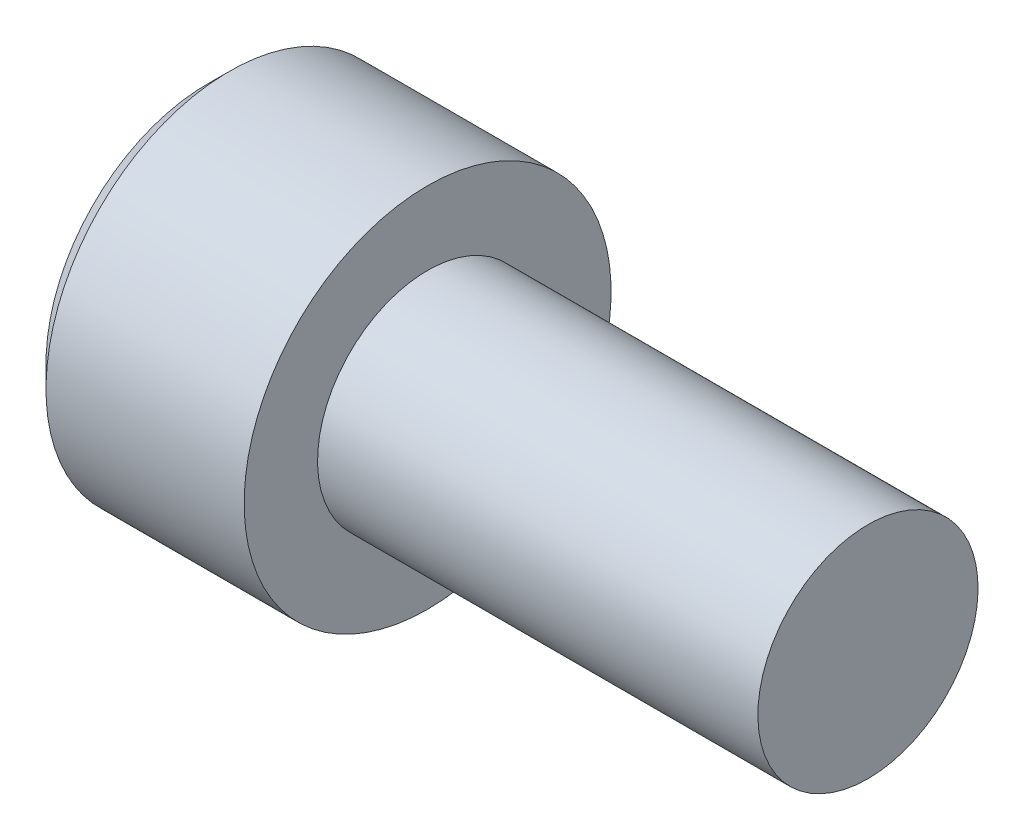
ISO-10303-21;
HEADER;
FILE_DESCRIPTION(('STEP AP214'),'2;1');
FILE_NAME('part.step','',(''),(''),'','','');
FILE_SCHEMA(('AUTOMOTIVE_DESIGN { 1 0 10303 214 1 1 1 1 }'));
ENDSEC;
DATA;
#1=APPLICATION_CONTEXT('core data for automotive mechanical design processes');
#2=APPLICATION_PROTOCOL_DEFINITION('international standard','automotive_design',2000,#1);
#3=PRODUCT_CONTEXT('',#1,'mechanical');
#4=PRODUCT('Part','Part','',(#3));
#5=PRODUCT_RELATED_PRODUCT_CATEGORY('part','',(#4));
#6=PRODUCT_DEFINITION_FORMATION('','',#4);
#7=PRODUCT_DEFINITION_CONTEXT('part definition',#1,'design');
#8=PRODUCT_DEFINITION('design','',#6,#7);
#9=PRODUCT_DEFINITION_SHAPE('','',#8);
#10=(LENGTH_UNIT() NAMED_UNIT(*) SI_UNIT(.MILLI.,.METRE.));
#11=(NAMED_UNIT(*) PLANE_ANGLE_UNIT() SI_UNIT($,.RADIAN.));
#12=(NAMED_UNIT(*) SI_UNIT($,.STERADIAN.) SOLID_ANGLE_UNIT());
#13=UNCERTAINTY_MEASURE_WITH_UNIT(LENGTH_MEASURE(1.E-05),#10,'distance_accuracy_value','');
#14=(GEOMETRIC_REPRESENTATION_CONTEXT(3) GLOBAL_UNCERTAINTY_ASSIGNED_CONTEXT((#13)) GLOBAL_UNIT_ASSIGNED_CONTEXT((#10,
#11,#12)) REPRESENTATION_CONTEXT('',''));
#15=CARTESIAN_POINT('',(0.,0.,0.));
#16=DIRECTION('',(0.,0.,1.));
#17=DIRECTION('',(1.,0.,0.));
#18=AXIS2_PLACEMENT_3D('',#15,#16,#17);
#19=CARTESIAN_POINT('',(-3.,0.,0.));
#20=DIRECTION('',(-1.,0.,0.));
#21=DIRECTION('',(0.,0.,1.));
#22=AXIS2_PLACEMENT_3D('',#19,#20,#21);
#23=PLANE('',#22);
#24=CARTESIAN_POINT('',(-2.9999999999998,0.,0.));
#25=DIRECTION('',(-1.,0.,0.));
#26=DIRECTION('',(0.,0.,1.));
#27=AXIS2_PLACEMENT_3D('',#24,#25,#26);
#28=CIRCLE('',#27,2.49999999999995);
#29=CARTESIAN_POINT('',(-2.9999999999999,2.16506350946107,1.24999999999999));
#30=VERTEX_POINT('',#29);
#31=CARTESIAN_POINT('',(-2.9999999999999,0.,2.49999999999997));
#32=VERTEX_POINT('',#31);
#33=EDGE_CURVE('E20',#30,#32,#28,.F.);
#34=ORIENTED_EDGE('',*,*,#33,.T.);
#35=DIRECTION('',(0.,1.,0.));
#36=VECTOR('',#35,1.);
#37=CARTESIAN_POINT('',(-3.,0.,2.5));
#38=LINE('',#37,#36);
#39=CARTESIAN_POINT('',(-3.,1.44337567297406,2.5));
#40=VERTEX_POINT('',#39);
#41=EDGE_CURVE('E85',#32,#40,#38,.T.);
#42=ORIENTED_EDGE('',*,*,#41,.T.);
#43=DIRECTION('',(0.,0.5,-0.866025403784438));
#44=VECTOR('',#43,1.);
#45=CARTESIAN_POINT('',(-3.,1.44337567297406,2.5));
#46=LINE('',#45,#44);
#47=EDGE_CURVE('E105',#40,#30,#46,.T.);
#48=ORIENTED_EDGE('',*,*,#47,.T.);
#49=EDGE_LOOP('',(#34,#42,#48));
#50=FACE_BOUND('',#49,.T.);
#51=ADVANCED_FACE('F17',(#50),#23,.T.);
#52=CARTESIAN_POINT('',(-3.,0.,0.));
#53=DIRECTION('',(-1.,0.,0.));
#54=DIRECTION('',(0.,0.,1.));
#55=AXIS2_PLACEMENT_3D('',#52,#53,#54);
#56=PLANE('',#55);
#57=CARTESIAN_POINT('',(-2.9999999999998,0.,0.));
#58=DIRECTION('',(-1.,0.,0.));
#59=DIRECTION('',(0.,0.,1.));
#60=AXIS2_PLACEMENT_3D('',#57,#58,#59);
#61=CIRCLE('',#60,2.49999999999995);
#62=CARTESIAN_POINT('',(-2.9999999999999,-2.16506350946107,1.24999999999999));
#63=VERTEX_POINT('',#62);
#64=EDGE_CURVE('E115',#32,#63,#61,.F.);
#65=ORIENTED_EDGE('',*,*,#64,.T.);
#66=DIRECTION('',(0.,0.5,0.866025403784439));
#67=VECTOR('',#66,1.);
#68=CARTESIAN_POINT('',(-3.,-2.1650635094611,1.25));
#69=LINE('',#68,#67);
#70=CARTESIAN_POINT('',(-3.,-1.44337567297406,2.5));
#71=VERTEX_POINT('',#70);
#72=EDGE_CURVE('E123',#63,#71,#69,.T.);
#73=ORIENTED_EDGE('',*,*,#72,.T.);
#74=DIRECTION('',(0.,1.,0.));
#75=VECTOR('',#74,1.);
#76=CARTESIAN_POINT('',(-3.,0.,2.5));
#77=LINE('',#76,#75);
#78=EDGE_CURVE('E131',#71,#32,#77,.T.);
#79=ORIENTED_EDGE('',*,*,#78,.T.);
#80=EDGE_LOOP('',(#65,#73,#79));
#81=FACE_BOUND('',#80,.T.);
#82=ADVANCED_FACE('F367',(#81),#56,.T.);
#83=CARTESIAN_POINT('',(-3.,0.,0.));
#84=DIRECTION('',(-1.,0.,0.));
#85=DIRECTION('',(0.,0.,1.));
#86=AXIS2_PLACEMENT_3D('',#83,#84,#85);
#87=PLANE('',#86);
#88=CARTESIAN_POINT('',(-2.9999999999998,0.,0.));
#89=DIRECTION('',(-1.,0.,0.));
#90=DIRECTION('',(0.,0.,1.));
#91=AXIS2_PLACEMENT_3D('',#88,#89,#90);
#92=CIRCLE('',#91,2.49999999999995);
#93=CARTESIAN_POINT('',(-2.9999999999999,0.,-2.49999999999997));
#94=VERTEX_POINT('',#93);
#95=CARTESIAN_POINT('',(-2.9999999999999,2.16506350946107,-1.24999999999999));
#96=VERTEX_POINT('',#95);
#97=EDGE_CURVE('E101',#94,#96,#92,.F.);
#98=ORIENTED_EDGE('',*,*,#97,.T.);
#99=DIRECTION('',(0.,-0.5,-0.866025403784439));
#100=VECTOR('',#99,1.);
#101=CARTESIAN_POINT('',(-3.,2.1650635094611,-1.25));
#102=LINE('',#101,#100);
#103=CARTESIAN_POINT('',(-3.,1.44337567297406,-2.5));
#104=VERTEX_POINT('',#103);
#105=EDGE_CURVE('E116',#96,#104,#102,.T.);
#106=ORIENTED_EDGE('',*,*,#105,.T.);
#107=DIRECTION('',(0.,1.,0.));
#108=VECTOR('',#107,1.);
#109=CARTESIAN_POINT('',(-3.,0.,-2.5));
#110=LINE('',#109,#108);
#111=EDGE_CURVE('E119',#104,#94,#110,.F.);
#112=ORIENTED_EDGE('',*,*,#111,.T.);
#113=EDGE_LOOP('',(#98,#106,#112));
#114=FACE_BOUND('',#113,.T.);
#115=ADVANCED_FACE('F358',(#114),#87,.T.);
#116=CARTESIAN_POINT('',(-2.99999999999967,0.,0.));
#117=DIRECTION('',(-1.,0.,0.));
#118=DIRECTION('',(0.,0.,1.));
#119=AXIS2_PLACEMENT_3D('',#116,#117,#118);
#120=CONICAL_SURFACE('',#119,2.49999999999972,1.04719755119659);
#121=CARTESIAN_POINT('',(-1.5566243270258,0.,0.));
#122=VERTEX_POINT('',#121);
#123=VERTEX_LOOP('',#122);
#124=FACE_BOUND('',#123,.T.);
#125=ORIENTED_EDGE('',*,*,#33,.F.);
#126=CARTESIAN_POINT('',(-2.9999999999998,0.,0.));
#127=DIRECTION('',(-1.,0.,0.));
#128=DIRECTION('',(0.,0.,1.));
#129=AXIS2_PLACEMENT_3D('',#126,#127,#128);
#130=CIRCLE('',#129,2.49999999999995);
#131=EDGE_CURVE('E91',#96,#30,#130,.F.);
#132=ORIENTED_EDGE('',*,*,#131,.F.);
#133=ORIENTED_EDGE('',*,*,#97,.F.);
#134=CARTESIAN_POINT('',(-2.9999999999998,0.,0.));
#135=DIRECTION('',(-1.,0.,0.));
#136=DIRECTION('',(0.,0.,1.));
#137=AXIS2_PLACEMENT_3D('',#134,#135,#136);
#138=CIRCLE('',#137,2.49999999999995);
#139=CARTESIAN_POINT('',(-2.9999999999999,-2.16506350946107,-1.24999999999999));
#140=VERTEX_POINT('',#139);
#141=EDGE_CURVE('E153',#140,#94,#138,.F.);
#142=ORIENTED_EDGE('',*,*,#141,.F.);
#143=CARTESIAN_POINT('',(-2.9999999999998,0.,0.));
#144=DIRECTION('',(-1.,0.,0.));
#145=DIRECTION('',(0.,0.,1.));
#146=AXIS2_PLACEMENT_3D('',#143,#144,#145);
#147=CIRCLE('',#146,2.49999999999995);
#148=EDGE_CURVE('E117',#63,#140,#147,.F.);
#149=ORIENTED_EDGE('',*,*,#148,.F.);
#150=ORIENTED_EDGE('',*,*,#64,.F.);
#151=EDGE_LOOP('',(#125,#132,#133,#142,#149,#150));
#152=FACE_BOUND('',#151,.T.);
#153=ADVANCED_FACE('F113',(#124,#152),#120,.F.);
#154=CARTESIAN_POINT('',(-3.,0.,0.));
#155=DIRECTION('',(-1.,0.,0.));
#156=DIRECTION('',(0.,0.,1.));
#157=AXIS2_PLACEMENT_3D('',#154,#155,#156);
#158=PLANE('',#157);
#159=ORIENTED_EDGE('',*,*,#141,.T.);
#160=DIRECTION('',(0.,1.,0.));
#161=VECTOR('',#160,1.);
#162=CARTESIAN_POINT('',(-3.,1.44337567297407,-2.5));
#163=LINE('',#162,#161);
#164=CARTESIAN_POINT('',(-3.,-1.44337567297406,-2.5));
#165=VERTEX_POINT('',#164);
#166=EDGE_CURVE('E155',#94,#165,#163,.F.);
#167=ORIENTED_EDGE('',*,*,#166,.T.);
#168=DIRECTION('',(0.,-0.500000000000001,0.866025403784438));
#169=VECTOR('',#168,1.);
#170=CARTESIAN_POINT('',(-3.,-1.44337567297406,-2.5));
#171=LINE('',#170,#169);
#172=EDGE_CURVE('E100',#165,#140,#171,.T.);
#173=ORIENTED_EDGE('',*,*,#172,.T.);
#174=EDGE_LOOP('',(#159,#167,#173));
#175=FACE_BOUND('',#174,.T.);
#176=ADVANCED_FACE('F177',(#175),#158,.T.);
#177=CARTESIAN_POINT('',(-3.,0.,0.));
#178=DIRECTION('',(-1.,0.,0.));
#179=DIRECTION('',(0.,0.,1.));
#180=AXIS2_PLACEMENT_3D('',#177,#178,#179);
#181=PLANE('',#180);
#182=ORIENTED_EDGE('',*,*,#148,.T.);
#183=DIRECTION('',(0.,0.5,-0.866025403784439));
#184=VECTOR('',#183,1.);
#185=CARTESIAN_POINT('',(-3.,-1.44337567297406,-2.5));
#186=LINE('',#185,#184);
#187=CARTESIAN_POINT('',(-3.,-2.88675134594813,0.));
#188=VERTEX_POINT('',#187);
#189=EDGE_CURVE('E162',#140,#188,#186,.F.);
#190=ORIENTED_EDGE('',*,*,#189,.T.);
#191=DIRECTION('',(0.,-0.5,-0.866025403784439));
#192=VECTOR('',#191,1.);
#193=CARTESIAN_POINT('',(-3.,-2.88675134594813,0.));
#194=LINE('',#193,#192);
#195=EDGE_CURVE('E141',#188,#63,#194,.F.);
#196=ORIENTED_EDGE('',*,*,#195,.T.);
#197=EDGE_LOOP('',(#182,#190,#196));
#198=FACE_BOUND('',#197,.T.);
#199=ADVANCED_FACE('F161',(#198),#181,.T.);
#200=CARTESIAN_POINT('',(-3.,0.,0.));
#201=DIRECTION('',(-1.,0.,0.));
#202=DIRECTION('',(0.,0.,1.));
#203=AXIS2_PLACEMENT_3D('',#200,#201,#202);
#204=PLANE('',#203);
#205=ORIENTED_EDGE('',*,*,#131,.T.);
#206=DIRECTION('',(0.,-0.5,0.866025403784439));
#207=VECTOR('',#206,1.);
#208=CARTESIAN_POINT('',(-3.,1.44337567297406,2.5));
#209=LINE('',#208,#207);
#210=CARTESIAN_POINT('',(-3.,2.88675134594813,0.));
#211=VERTEX_POINT('',#210);
#212=EDGE_CURVE('E94',#30,#211,#209,.F.);
#213=ORIENTED_EDGE('',*,*,#212,.T.);
#214=DIRECTION('',(0.,0.5,0.866025403784439));
#215=VECTOR('',#214,1.);
#216=CARTESIAN_POINT('',(-3.,2.88675134594813,0.));
#217=LINE('',#216,#215);
#218=EDGE_CURVE('E96',#211,#96,#217,.F.);
#219=ORIENTED_EDGE('',*,*,#218,.T.);
#220=EDGE_LOOP('',(#205,#213,#219));
#221=FACE_BOUND('',#220,.T.);
#222=ADVANCED_FACE('F93',(#221),#204,.T.);
#223=CARTESIAN_POINT('',(-3.,1.44337567297407,-2.5));
#224=DIRECTION('',(0.,0.,-1.));
#225=DIRECTION('',(-1.,0.,0.));
#226=AXIS2_PLACEMENT_3D('',#223,#224,#225);
#227=PLANE('',#226);
#228=DIRECTION('',(1.,0.,0.));
#229=VECTOR('',#228,1.);
#230=CARTESIAN_POINT('',(-3.,-1.44337567297406,-2.5));
#231=LINE('',#230,#229);
#232=CARTESIAN_POINT('',(-6.,-1.44337567297406,-2.5));
#233=VERTEX_POINT('',#232);
#234=EDGE_CURVE('E126',#233,#165,#231,.T.);
#235=ORIENTED_EDGE('',*,*,#234,.T.);
#236=ORIENTED_EDGE('',*,*,#166,.F.);
#237=ORIENTED_EDGE('',*,*,#111,.F.);
#238=DIRECTION('',(1.,0.,0.));
#239=VECTOR('',#238,1.);
#240=CARTESIAN_POINT('',(-3.,1.44337567297407,-2.5));
#241=LINE('',#240,#239);
#242=CARTESIAN_POINT('',(-6.,1.44337567297407,-2.5));
#243=VERTEX_POINT('',#242);
#244=EDGE_CURVE('E134',#104,#243,#241,.F.);
#245=ORIENTED_EDGE('',*,*,#244,.T.);
#246=DIRECTION('',(0.,1.,0.));
#247=VECTOR('',#246,1.);
#248=CARTESIAN_POINT('',(-6.,0.,-2.5));
#249=LINE('',#248,#247);
#250=EDGE_CURVE('E137',#243,#233,#249,.F.);
#251=ORIENTED_EDGE('',*,*,#250,.T.);
#252=EDGE_LOOP('',(#235,#236,#237,#245,#251));
#253=FACE_BOUND('',#252,.T.);
#254=ADVANCED_FACE('F185',(#253),#227,.F.);
#255=CARTESIAN_POINT('',(-3.,-1.44337567297406,-2.5));
#256=DIRECTION('',(0.,-0.866025403784439,-0.5));
#257=DIRECTION('',(0.,0.5,-0.866025403784439));
#258=AXIS2_PLACEMENT_3D('',#255,#256,#257);
#259=PLANE('',#258);
#260=DIRECTION('',(1.,0.,0.));
#261=VECTOR('',#260,1.);
#262=CARTESIAN_POINT('',(-3.,-2.88675134594813,0.));
#263=LINE('',#262,#261);
#264=CARTESIAN_POINT('',(-6.,-2.88675134594813,0.));
#265=VERTEX_POINT('',#264);
#266=EDGE_CURVE('E173',#265,#188,#263,.T.);
#267=ORIENTED_EDGE('',*,*,#266,.T.);
#268=ORIENTED_EDGE('',*,*,#189,.F.);
#269=ORIENTED_EDGE('',*,*,#172,.F.);
#270=ORIENTED_EDGE('',*,*,#234,.F.);
#271=DIRECTION('',(0.,-0.5,0.866025403784439));
#272=VECTOR('',#271,1.);
#273=CARTESIAN_POINT('',(-6.,-1.44337567297406,-2.5));
#274=LINE('',#273,#272);
#275=EDGE_CURVE('E188',#233,#265,#274,.T.);
#276=ORIENTED_EDGE('',*,*,#275,.T.);
#277=EDGE_LOOP('',(#267,#268,#269,#270,#276));
#278=FACE_BOUND('',#277,.T.);
#279=ADVANCED_FACE('F168',(#278),#259,.F.);
#280=CARTESIAN_POINT('',(-3.,-2.88675134594813,0.));
#281=DIRECTION('',(0.,-0.866025403784439,0.5));
#282=DIRECTION('',(0.,-0.5,-0.866025403784439));
#283=AXIS2_PLACEMENT_3D('',#280,#281,#282);
#284=PLANE('',#283);
#285=DIRECTION('',(1.,0.,0.));
#286=VECTOR('',#285,1.);
#287=CARTESIAN_POINT('',(-3.,-1.44337567297406,2.5));
#288=LINE('',#287,#286);
#289=CARTESIAN_POINT('',(-6.,-1.44337567297406,2.5));
#290=VERTEX_POINT('',#289);
#291=EDGE_CURVE('E138',#290,#71,#288,.T.);
#292=ORIENTED_EDGE('',*,*,#291,.T.);
#293=ORIENTED_EDGE('',*,*,#72,.F.);
#294=ORIENTED_EDGE('',*,*,#195,.F.);
#295=ORIENTED_EDGE('',*,*,#266,.F.);
#296=DIRECTION('',(0.,0.5,0.866025403784439));
#297=VECTOR('',#296,1.);
#298=CARTESIAN_POINT('',(-6.,-2.88675134594813,0.));
#299=LINE('',#298,#297);
#300=EDGE_CURVE('E181',#265,#290,#299,.T.);
#301=ORIENTED_EDGE('',*,*,#300,.T.);
#302=EDGE_LOOP('',(#292,#293,#294,#295,#301));
#303=FACE_BOUND('',#302,.T.);
#304=ADVANCED_FACE('F307',(#303),#284,.F.);
#305=CARTESIAN_POINT('',(-3.,-1.44337567297406,2.5));
#306=DIRECTION('',(0.,0.,1.));
#307=DIRECTION('',(1.,0.,0.));
#308=AXIS2_PLACEMENT_3D('',#305,#306,#307);
#309=PLANE('',#308);
#310=DIRECTION('',(1.,0.,0.));
#311=VECTOR('',#310,1.);
#312=CARTESIAN_POINT('',(-3.,1.44337567297406,2.5));
#313=LINE('',#312,#311);
#314=CARTESIAN_POINT('',(-6.,1.44337567297406,2.5));
#315=VERTEX_POINT('',#314);
#316=EDGE_CURVE('E107',#315,#40,#313,.T.);
#317=ORIENTED_EDGE('',*,*,#316,.T.);
#318=ORIENTED_EDGE('',*,*,#41,.F.);
#319=ORIENTED_EDGE('',*,*,#78,.F.);
#320=ORIENTED_EDGE('',*,*,#291,.F.);
#321=DIRECTION('',(0.,1.,0.));
#322=VECTOR('',#321,1.);
#323=CARTESIAN_POINT('',(-6.,0.,2.5));
#324=LINE('',#323,#322);
#325=EDGE_CURVE('E196',#290,#315,#324,.T.);
#326=ORIENTED_EDGE('',*,*,#325,.T.);
#327=EDGE_LOOP('',(#317,#318,#319,#320,#326));
#328=FACE_BOUND('',#327,.T.);
#329=ADVANCED_FACE('F299',(#328),#309,.F.);
#330=CARTESIAN_POINT('',(-3.,1.44337567297406,2.5));
#331=DIRECTION('',(0.,0.866025403784439,0.5));
#332=DIRECTION('',(0.,-0.5,0.866025403784439));
#333=AXIS2_PLACEMENT_3D('',#330,#331,#332);
#334=PLANE('',#333);
#335=DIRECTION('',(1.,0.,0.));
#336=VECTOR('',#335,1.);
#337=CARTESIAN_POINT('',(-3.,2.88675134594813,0.));
#338=LINE('',#337,#336);
#339=CARTESIAN_POINT('',(-6.,2.88675134594813,0.));
#340=VERTEX_POINT('',#339);
#341=EDGE_CURVE('E106',#340,#211,#338,.T.);
#342=ORIENTED_EDGE('',*,*,#341,.T.);
#343=ORIENTED_EDGE('',*,*,#212,.F.);
#344=ORIENTED_EDGE('',*,*,#47,.F.);
#345=ORIENTED_EDGE('',*,*,#316,.F.);
#346=DIRECTION('',(0.,0.5,-0.866025403784439));
#347=VECTOR('',#346,1.);
#348=CARTESIAN_POINT('',(-6.,1.44337567297406,2.5));
#349=LINE('',#348,#347);
#350=EDGE_CURVE('E35',#315,#340,#349,.T.);
#351=ORIENTED_EDGE('',*,*,#350,.T.);
#352=EDGE_LOOP('',(#342,#343,#344,#345,#351));
#353=FACE_BOUND('',#352,.T.);
#354=ADVANCED_FACE('F104',(#353),#334,.F.);
#355=CARTESIAN_POINT('',(-3.,2.88675134594813,0.));
#356=DIRECTION('',(0.,0.866025403784439,-0.5));
#357=DIRECTION('',(0.,0.5,0.866025403784439));
#358=AXIS2_PLACEMENT_3D('',#355,#356,#357);
#359=PLANE('',#358);
#360=ORIENTED_EDGE('',*,*,#244,.F.);
#361=ORIENTED_EDGE('',*,*,#105,.F.);
#362=ORIENTED_EDGE('',*,*,#218,.F.);
#363=ORIENTED_EDGE('',*,*,#341,.F.);
#364=DIRECTION('',(0.,-0.5,-0.866025403784439));
#365=VECTOR('',#364,1.);
#366=CARTESIAN_POINT('',(-6.,2.88675134594813,0.));
#367=LINE('',#366,#365);
#368=EDGE_CURVE('E152',#340,#243,#367,.T.);
#369=ORIENTED_EDGE('',*,*,#368,.T.);
#370=EDGE_LOOP('',(#360,#361,#362,#363,#369));
#371=FACE_BOUND('',#370,.T.);
#372=ADVANCED_FACE('F219',(#371),#359,.F.);
#373=CARTESIAN_POINT('',(-6.,0.,0.));
#374=DIRECTION('',(1.,0.,0.));
#375=DIRECTION('',(0.,1.,0.));
#376=AXIS2_PLACEMENT_3D('',#373,#374,#375);
#377=PLANE('',#376);
#378=ORIENTED_EDGE('',*,*,#350,.F.);
#379=ORIENTED_EDGE('',*,*,#325,.F.);
#380=ORIENTED_EDGE('',*,*,#300,.F.);
#381=ORIENTED_EDGE('',*,*,#275,.F.);
#382=ORIENTED_EDGE('',*,*,#250,.F.);
#383=ORIENTED_EDGE('',*,*,#368,.F.);
#384=EDGE_LOOP('',(#378,#379,#380,#381,#382,#383));
#385=FACE_BOUND('',#384,.T.);
#386=CARTESIAN_POINT('',(-5.99999999997181,0.,0.));
#387=DIRECTION('',(1.,0.,0.));
#388=DIRECTION('',(0.,0.,-1.));
#389=AXIS2_PLACEMENT_3D('',#386,#387,#388);
#390=CIRCLE('',#389,4.39999999991869);
#391=CARTESIAN_POINT('',(-5.99999999997181,0.,-4.39999999991869));
#392=VERTEX_POINT('',#391);
#393=EDGE_CURVE('E149',#392,#392,#390,.T.);
#394=ORIENTED_EDGE('',*,*,#393,.F.);
#395=EDGE_LOOP('',(#394));
#396=FACE_BOUND('',#395,.T.);
#397=ADVANCED_FACE('F191',(#385,#396),#377,.F.);
#398=CARTESIAN_POINT('',(-5.40000000000873,0.,0.));
#399=DIRECTION('',(1.,0.,0.));
#400=DIRECTION('',(0.,0.,-1.));
#401=AXIS2_PLACEMENT_3D('',#398,#399,#400);
#402=CONICAL_SURFACE('',#401,4.99999999988177,0.785398163397448);
#403=CARTESIAN_POINT('',(-5.4,0.,0.));
#404=DIRECTION('',(-1.,0.,0.));
#405=DIRECTION('',(0.,-1.,0.));
#406=AXIS2_PLACEMENT_3D('',#403,#404,#405);
#407=CIRCLE('',#406,5.);
#408=CARTESIAN_POINT('',(-5.4,-5.,0.));
#409=VERTEX_POINT('',#408);
#410=EDGE_CURVE('E148',#409,#409,#407,.F.);
#411=ORIENTED_EDGE('',*,*,#410,.F.);
#412=EDGE_LOOP('',(#411));
#413=FACE_BOUND('',#412,.T.);
#414=ORIENTED_EDGE('',*,*,#393,.T.);
#415=EDGE_LOOP('',(#414));
#416=FACE_BOUND('',#415,.T.);
#417=ADVANCED_FACE('F213',(#413,#416),#402,.T.);
#418=CARTESIAN_POINT('',(-6.,0.,0.));
#419=DIRECTION('',(-1.,0.,0.));
#420=DIRECTION('',(0.,-1.,0.));
#421=AXIS2_PLACEMENT_3D('',#418,#419,#420);
#422=CYLINDRICAL_SURFACE('',#421,5.);
#423=ORIENTED_EDGE('',*,*,#410,.T.);
#424=EDGE_LOOP('',(#423));
#425=FACE_BOUND('',#424,.T.);
#426=CARTESIAN_POINT('',(0.,0.,0.));
#427=DIRECTION('',(-1.,0.,0.));
#428=DIRECTION('',(0.,-1.,0.));
#429=AXIS2_PLACEMENT_3D('',#426,#427,#428);
#430=CIRCLE('',#429,5.);
#431=CARTESIAN_POINT('',(0.,-5.,0.));
#432=VERTEX_POINT('',#431);
#433=EDGE_CURVE('E145',#432,#432,#430,.T.);
#434=ORIENTED_EDGE('',*,*,#433,.T.);
#435=EDGE_LOOP('',(#434));
#436=FACE_BOUND('',#435,.T.);
#437=ADVANCED_FACE('F210',(#425,#436),#422,.T.);
#438=CARTESIAN_POINT('',(12.,3.,0.));
#439=DIRECTION('',(-1.,0.,0.));
#440=DIRECTION('',(0.,-1.,0.));
#441=AXIS2_PLACEMENT_3D('',#438,#439,#440);
#442=PLANE('',#441);
#443=CARTESIAN_POINT('',(12.,0.,0.));
#444=DIRECTION('',(-1.,0.,0.));
#445=DIRECTION('',(0.,-1.,0.));
#446=AXIS2_PLACEMENT_3D('',#443,#444,#445);
#447=CIRCLE('',#446,3.);
#448=CARTESIAN_POINT('',(12.,-3.,0.));
#449=VERTEX_POINT('',#448);
#450=EDGE_CURVE('E26',#449,#449,#447,.T.);
#451=ORIENTED_EDGE('',*,*,#450,.F.);
#452=EDGE_LOOP('',(#451));
#453=FACE_BOUND('',#452,.T.);
#454=ADVANCED_FACE('F235',(#453),#442,.F.);
#455=CARTESIAN_POINT('',(0.,3.,0.));
#456=DIRECTION('',(-1.,0.,0.));
#457=DIRECTION('',(0.,-1.,0.));
#458=AXIS2_PLACEMENT_3D('',#455,#456,#457);
#459=PLANE('',#458);
#460=CARTESIAN_POINT('',(0.,0.,0.));
#461=DIRECTION('',(-1.,0.,0.));
#462=DIRECTION('',(0.,-1.,0.));
#463=AXIS2_PLACEMENT_3D('',#460,#461,#462);
#464=CIRCLE('',#463,3.);
#465=CARTESIAN_POINT('',(0.,-3.,0.));
#466=VERTEX_POINT('',#465);
#467=EDGE_CURVE('E10',#466,#466,#464,.F.);
#468=ORIENTED_EDGE('',*,*,#467,.F.);
#469=EDGE_LOOP('',(#468));
#470=FACE_BOUND('',#469,.T.);
#471=ORIENTED_EDGE('',*,*,#433,.F.);
#472=EDGE_LOOP('',(#471));
#473=FACE_BOUND('',#472,.T.);
#474=ADVANCED_FACE('F229',(#470,#473),#459,.F.);
#475=CARTESIAN_POINT('',(-6.,0.,0.));
#476=DIRECTION('',(-1.,0.,0.));
#477=DIRECTION('',(0.,-1.,0.));
#478=AXIS2_PLACEMENT_3D('',#475,#476,#477);
#479=CYLINDRICAL_SURFACE('',#478,3.);
#480=ORIENTED_EDGE('',*,*,#467,.T.);
#481=EDGE_LOOP('',(#480));
#482=FACE_BOUND('',#481,.T.);
#483=ORIENTED_EDGE('',*,*,#450,.T.);
#484=EDGE_LOOP('',(#483));
#485=FACE_BOUND('',#484,.T.);
#486=ADVANCED_FACE('F227',(#482,#485),#479,.T.);
#487=CLOSED_SHELL('',(#51,#82,#115,#153,#176,#199,#222,#254,#279,#304,#329,#354,#372,#397,#417,
#437,#454,#474,#486));
#488=MANIFOLD_SOLID_BREP('B1',#487);
#489=ADVANCED_BREP_SHAPE_REPRESENTATION('',(#18,#488),#14);
#490=SHAPE_DEFINITION_REPRESENTATION(#9,#489);
ENDSEC;
END-ISO-10303-21;
